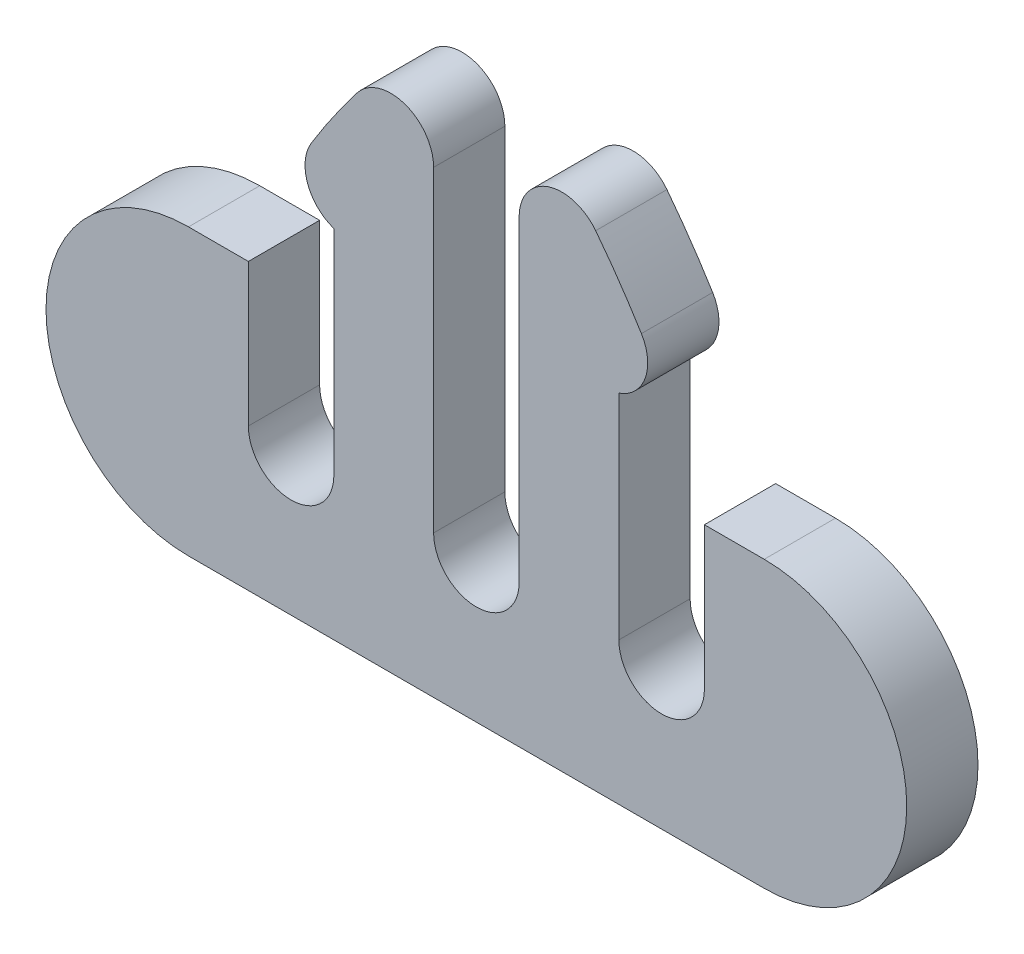
ISO-10303-21;
HEADER;
FILE_DESCRIPTION(('STEP AP214'),'2;1');
FILE_NAME('part.step','',(''),(''),'','','');
FILE_SCHEMA(('AUTOMOTIVE_DESIGN { 1 0 10303 214 1 1 1 1 }'));
ENDSEC;
DATA;
#1=APPLICATION_CONTEXT('core data for automotive mechanical design processes');
#2=APPLICATION_PROTOCOL_DEFINITION('international standard','automotive_design',2000,#1);
#3=PRODUCT_CONTEXT('',#1,'mechanical');
#4=PRODUCT('Part','Part','',(#3));
#5=PRODUCT_RELATED_PRODUCT_CATEGORY('part','',(#4));
#6=PRODUCT_DEFINITION_FORMATION('','',#4);
#7=PRODUCT_DEFINITION_CONTEXT('part definition',#1,'design');
#8=PRODUCT_DEFINITION('design','',#6,#7);
#9=PRODUCT_DEFINITION_SHAPE('','',#8);
#10=(LENGTH_UNIT() NAMED_UNIT(*) SI_UNIT(.MILLI.,.METRE.));
#11=(NAMED_UNIT(*) PLANE_ANGLE_UNIT() SI_UNIT($,.RADIAN.));
#12=(NAMED_UNIT(*) SI_UNIT($,.STERADIAN.) SOLID_ANGLE_UNIT());
#13=UNCERTAINTY_MEASURE_WITH_UNIT(LENGTH_MEASURE(1.E-05),#10,'distance_accuracy_value','');
#14=(GEOMETRIC_REPRESENTATION_CONTEXT(3) GLOBAL_UNCERTAINTY_ASSIGNED_CONTEXT((#13)) GLOBAL_UNIT_ASSIGNED_CONTEXT((#10,
#11,#12)) REPRESENTATION_CONTEXT('',''));
#15=CARTESIAN_POINT('',(0.,0.,0.));
#16=DIRECTION('',(0.,0.,1.));
#17=DIRECTION('',(1.,0.,0.));
#18=AXIS2_PLACEMENT_3D('',#15,#16,#17);
#19=CARTESIAN_POINT('',(-22.8376155637193,46.0831774343637,2.5));
#20=DIRECTION('',(1.,0.,0.));
#21=DIRECTION('',(0.,0.,-1.));
#22=AXIS2_PLACEMENT_3D('',#19,#20,#21);
#23=PLANE('',#22);
#24=DIRECTION('',(0.,-1.,0.));
#25=VECTOR('',#24,1.);
#26=CARTESIAN_POINT('',(-22.8376155637193,46.0831774343637,0.));
#27=LINE('',#26,#25);
#28=CARTESIAN_POINT('',(-22.8376155637193,48.5831774343637,0.));
#29=VERTEX_POINT('',#28);
#30=CARTESIAN_POINT('',(-22.8376155637193,41.0831774343637,0.));
#31=VERTEX_POINT('',#30);
#32=EDGE_CURVE('E388',#29,#31,#27,.T.);
#33=ORIENTED_EDGE('',*,*,#32,.T.);
#34=DIRECTION('',(0.,0.,1.));
#35=VECTOR('',#34,1.);
#36=CARTESIAN_POINT('',(-22.8376155637193,41.0831774343637,-8.54400374531753));
#37=LINE('',#36,#35);
#38=CARTESIAN_POINT('',(-22.8376155637193,41.0831774343637,2.5));
#39=VERTEX_POINT('',#38);
#40=EDGE_CURVE('E208',#31,#39,#37,.T.);
#41=ORIENTED_EDGE('',*,*,#40,.T.);
#42=DIRECTION('',(0.,-1.,0.));
#43=VECTOR('',#42,1.);
#44=CARTESIAN_POINT('',(-22.8376155637193,46.0831774343637,2.5));
#45=LINE('',#44,#43);
#46=CARTESIAN_POINT('',(-22.8376155637193,48.5831774343637,2.5));
#47=VERTEX_POINT('',#46);
#48=EDGE_CURVE('E237',#47,#39,#45,.T.);
#49=ORIENTED_EDGE('',*,*,#48,.F.);
#50=DIRECTION('',(0.,0.,-1.));
#51=VECTOR('',#50,1.);
#52=CARTESIAN_POINT('',(-22.8376155637193,48.5831774343637,2.5));
#53=LINE('',#52,#51);
#54=EDGE_CURVE('E357',#47,#29,#53,.T.);
#55=ORIENTED_EDGE('',*,*,#54,.T.);
#56=EDGE_LOOP('',(#33,#41,#49,#55));
#57=FACE_BOUND('',#56,.T.);
#58=ADVANCED_FACE('F37',(#57),#23,.F.);
#59=CARTESIAN_POINT('',(-22.8376155637193,46.0831774343637,2.5));
#60=DIRECTION('',(0.,-1.,0.));
#61=DIRECTION('',(0.,0.,-1.));
#62=AXIS2_PLACEMENT_3D('',#59,#60,#61);
#63=PLANE('',#62);
#64=DIRECTION('',(-1.,0.,0.));
#65=VECTOR('',#64,1.);
#66=CARTESIAN_POINT('',(-22.8376155637193,46.0831774343637,2.5));
#67=LINE('',#66,#65);
#68=CARTESIAN_POINT('',(-25.8376155637193,46.0831774343637,2.5));
#69=VERTEX_POINT('',#68);
#70=CARTESIAN_POINT('',(-27.9376155637193,46.0831774343637,2.5));
#71=VERTEX_POINT('',#70);
#72=EDGE_CURVE('E239',#69,#71,#67,.T.);
#73=ORIENTED_EDGE('',*,*,#72,.F.);
#74=DIRECTION('',(0.,0.,1.));
#75=VECTOR('',#74,1.);
#76=CARTESIAN_POINT('',(-25.8376155637193,46.0831774343637,-8.54400374531753));
#77=LINE('',#76,#75);
#78=CARTESIAN_POINT('',(-25.8376155637193,46.0831774343637,0.));
#79=VERTEX_POINT('',#78);
#80=EDGE_CURVE('E206',#79,#69,#77,.T.);
#81=ORIENTED_EDGE('',*,*,#80,.F.);
#82=DIRECTION('',(-1.,0.,0.));
#83=VECTOR('',#82,1.);
#84=CARTESIAN_POINT('',(-22.8376155637193,46.0831774343637,0.));
#85=LINE('',#84,#83);
#86=CARTESIAN_POINT('',(-27.9376155637193,46.0831774343637,0.));
#87=VERTEX_POINT('',#86);
#88=EDGE_CURVE('E386',#79,#87,#85,.T.);
#89=ORIENTED_EDGE('',*,*,#88,.T.);
#90=DIRECTION('',(0.,0.,-1.));
#91=VECTOR('',#90,1.);
#92=CARTESIAN_POINT('',(-27.9376155637193,46.0831774343637,2.5));
#93=LINE('',#92,#91);
#94=EDGE_CURVE('E343',#71,#87,#93,.T.);
#95=ORIENTED_EDGE('',*,*,#94,.F.);
#96=EDGE_LOOP('',(#73,#81,#89,#95));
#97=FACE_BOUND('',#96,.T.);
#98=ADVANCED_FACE('F288',(#97),#63,.F.);
#99=CARTESIAN_POINT('',(-27.9376155637193,41.0831774343637,2.5));
#100=DIRECTION('',(0.,0.,-1.));
#101=DIRECTION('',(-1.,0.,0.));
#102=AXIS2_PLACEMENT_3D('',#99,#100,#101);
#103=CYLINDRICAL_SURFACE('',#102,5.);
#104=CARTESIAN_POINT('',(-27.9376155637193,41.0831774343637,0.));
#105=DIRECTION('',(0.,0.,1.));
#106=DIRECTION('',(1.,0.,0.));
#107=AXIS2_PLACEMENT_3D('',#104,#105,#106);
#108=CIRCLE('',#107,5.);
#109=CARTESIAN_POINT('',(-27.9376155637193,36.0831774343637,0.));
#110=VERTEX_POINT('',#109);
#111=EDGE_CURVE('E384',#87,#110,#108,.T.);
#112=ORIENTED_EDGE('',*,*,#111,.T.);
#113=DIRECTION('',(0.,0.,-1.));
#114=VECTOR('',#113,1.);
#115=CARTESIAN_POINT('',(-27.9376155637193,36.0831774343637,2.5));
#116=LINE('',#115,#114);
#117=CARTESIAN_POINT('',(-27.9376155637193,36.0831774343637,2.5));
#118=VERTEX_POINT('',#117);
#119=EDGE_CURVE('E346',#118,#110,#116,.T.);
#120=ORIENTED_EDGE('',*,*,#119,.F.);
#121=CARTESIAN_POINT('',(-27.9376155637193,41.0831774343637,2.5));
#122=DIRECTION('',(0.,0.,1.));
#123=DIRECTION('',(1.,0.,0.));
#124=AXIS2_PLACEMENT_3D('',#121,#122,#123);
#125=CIRCLE('',#124,5.);
#126=EDGE_CURVE('E242',#71,#118,#125,.T.);
#127=ORIENTED_EDGE('',*,*,#126,.F.);
#128=ORIENTED_EDGE('',*,*,#94,.T.);
#129=EDGE_LOOP('',(#112,#120,#127,#128));
#130=FACE_BOUND('',#129,.T.);
#131=ADVANCED_FACE('F284',(#130),#103,.T.);
#132=CARTESIAN_POINT('',(-7.73761556371935,36.0831774343637,2.5));
#133=DIRECTION('',(0.,1.,0.));
#134=DIRECTION('',(0.,0.,1.));
#135=AXIS2_PLACEMENT_3D('',#132,#133,#134);
#136=PLANE('',#135);
#137=DIRECTION('',(1.,0.,0.));
#138=VECTOR('',#137,1.);
#139=CARTESIAN_POINT('',(-7.73761556371935,36.0831774343637,0.));
#140=LINE('',#139,#138);
#141=CARTESIAN_POINT('',(-7.73761556371935,36.0831774343637,0.));
#142=VERTEX_POINT('',#141);
#143=EDGE_CURVE('E382',#110,#142,#140,.T.);
#144=ORIENTED_EDGE('',*,*,#143,.T.);
#145=DIRECTION('',(0.,0.,-1.));
#146=VECTOR('',#145,1.);
#147=CARTESIAN_POINT('',(-7.73761556371935,36.0831774343637,2.5));
#148=LINE('',#147,#146);
#149=CARTESIAN_POINT('',(-7.73761556371935,36.0831774343637,2.5));
#150=VERTEX_POINT('',#149);
#151=EDGE_CURVE('E349',#150,#142,#148,.T.);
#152=ORIENTED_EDGE('',*,*,#151,.F.);
#153=DIRECTION('',(1.,0.,0.));
#154=VECTOR('',#153,1.);
#155=CARTESIAN_POINT('',(-7.73761556371935,36.0831774343637,2.5));
#156=LINE('',#155,#154);
#157=EDGE_CURVE('E244',#118,#150,#156,.T.);
#158=ORIENTED_EDGE('',*,*,#157,.F.);
#159=ORIENTED_EDGE('',*,*,#119,.T.);
#160=EDGE_LOOP('',(#144,#152,#158,#159));
#161=FACE_BOUND('',#160,.T.);
#162=ADVANCED_FACE('F280',(#161),#136,.F.);
#163=CARTESIAN_POINT('',(-7.73761556371935,41.0831774343637,2.5));
#164=DIRECTION('',(0.,0.,-1.));
#165=DIRECTION('',(-1.,0.,0.));
#166=AXIS2_PLACEMENT_3D('',#163,#164,#165);
#167=CYLINDRICAL_SURFACE('',#166,5.);
#168=CARTESIAN_POINT('',(-7.73761556371935,41.0831774343637,0.));
#169=DIRECTION('',(0.,0.,1.));
#170=DIRECTION('',(1.,0.,0.));
#171=AXIS2_PLACEMENT_3D('',#168,#169,#170);
#172=CIRCLE('',#171,5.);
#173=CARTESIAN_POINT('',(-7.73761556371934,46.0831774343637,0.));
#174=VERTEX_POINT('',#173);
#175=EDGE_CURVE('E380',#142,#174,#172,.T.);
#176=ORIENTED_EDGE('',*,*,#175,.T.);
#177=DIRECTION('',(0.,0.,-1.));
#178=VECTOR('',#177,1.);
#179=CARTESIAN_POINT('',(-7.73761556371934,46.0831774343637,2.5));
#180=LINE('',#179,#178);
#181=CARTESIAN_POINT('',(-7.73761556371934,46.0831774343637,2.5));
#182=VERTEX_POINT('',#181);
#183=EDGE_CURVE('E352',#182,#174,#180,.T.);
#184=ORIENTED_EDGE('',*,*,#183,.F.);
#185=CARTESIAN_POINT('',(-7.73761556371935,41.0831774343637,2.5));
#186=DIRECTION('',(0.,0.,1.));
#187=DIRECTION('',(1.,0.,0.));
#188=AXIS2_PLACEMENT_3D('',#185,#186,#187);
#189=CIRCLE('',#188,5.);
#190=EDGE_CURVE('E246',#150,#182,#189,.T.);
#191=ORIENTED_EDGE('',*,*,#190,.F.);
#192=ORIENTED_EDGE('',*,*,#151,.T.);
#193=EDGE_LOOP('',(#176,#184,#191,#192));
#194=FACE_BOUND('',#193,.T.);
#195=ADVANCED_FACE('F276',(#194),#167,.T.);
#196=CARTESIAN_POINT('',(-12.8376155637193,46.0831774343637,2.5));
#197=DIRECTION('',(0.,-1.,0.));
#198=DIRECTION('',(1.,0.,0.));
#199=AXIS2_PLACEMENT_3D('',#196,#197,#198);
#200=PLANE('',#199);
#201=DIRECTION('',(-1.,0.,0.));
#202=VECTOR('',#201,1.);
#203=CARTESIAN_POINT('',(-12.8376155637193,46.0831774343637,0.));
#204=LINE('',#203,#202);
#205=CARTESIAN_POINT('',(-9.83761556371932,46.0831774343637,0.));
#206=VERTEX_POINT('',#205);
#207=EDGE_CURVE('E186',#174,#206,#204,.T.);
#208=ORIENTED_EDGE('',*,*,#207,.T.);
#209=DIRECTION('',(0.,0.,1.));
#210=VECTOR('',#209,1.);
#211=CARTESIAN_POINT('',(-9.83761556371932,46.0831774343637,-8.54400374531753));
#212=LINE('',#211,#210);
#213=CARTESIAN_POINT('',(-9.83761556371932,46.0831774343637,2.5));
#214=VERTEX_POINT('',#213);
#215=EDGE_CURVE('E390',#206,#214,#212,.T.);
#216=ORIENTED_EDGE('',*,*,#215,.T.);
#217=DIRECTION('',(-1.,0.,0.));
#218=VECTOR('',#217,1.);
#219=CARTESIAN_POINT('',(-12.8376155637193,46.0831774343637,2.5));
#220=LINE('',#219,#218);
#221=EDGE_CURVE('E248',#182,#214,#220,.T.);
#222=ORIENTED_EDGE('',*,*,#221,.F.);
#223=ORIENTED_EDGE('',*,*,#183,.T.);
#224=EDGE_LOOP('',(#208,#216,#222,#223));
#225=FACE_BOUND('',#224,.T.);
#226=ADVANCED_FACE('F273',(#225),#200,.F.);
#227=CARTESIAN_POINT('',(-12.8376155637193,46.0831774343637,2.5));
#228=DIRECTION('',(-1.,0.,0.));
#229=DIRECTION('',(0.,-1.,0.));
#230=AXIS2_PLACEMENT_3D('',#227,#228,#229);
#231=PLANE('',#230);
#232=DIRECTION('',(0.,1.,0.));
#233=VECTOR('',#232,1.);
#234=CARTESIAN_POINT('',(-12.8376155637193,46.0831774343637,0.));
#235=LINE('',#234,#233);
#236=CARTESIAN_POINT('',(-12.8376155637193,41.0831774343637,0.));
#237=VERTEX_POINT('',#236);
#238=CARTESIAN_POINT('',(-12.8376155637193,48.5831774343637,0.));
#239=VERTEX_POINT('',#238);
#240=EDGE_CURVE('E173',#237,#239,#235,.T.);
#241=ORIENTED_EDGE('',*,*,#240,.T.);
#242=DIRECTION('',(0.,0.,-1.));
#243=VECTOR('',#242,1.);
#244=CARTESIAN_POINT('',(-12.8376155637193,48.5831774343637,2.5));
#245=LINE('',#244,#243);
#246=CARTESIAN_POINT('',(-12.8376155637193,48.5831774343637,2.5));
#247=VERTEX_POINT('',#246);
#248=EDGE_CURVE('E355',#247,#239,#245,.T.);
#249=ORIENTED_EDGE('',*,*,#248,.F.);
#250=DIRECTION('',(0.,1.,0.));
#251=VECTOR('',#250,1.);
#252=CARTESIAN_POINT('',(-12.8376155637193,46.0831774343637,2.5));
#253=LINE('',#252,#251);
#254=CARTESIAN_POINT('',(-12.8376155637193,41.0831774343637,2.5));
#255=VERTEX_POINT('',#254);
#256=EDGE_CURVE('E198',#255,#247,#253,.T.);
#257=ORIENTED_EDGE('',*,*,#256,.F.);
#258=DIRECTION('',(0.,0.,1.));
#259=VECTOR('',#258,1.);
#260=CARTESIAN_POINT('',(-12.8376155637193,41.0831774343637,-8.54400374531753));
#261=LINE('',#260,#259);
#262=EDGE_CURVE('E193',#237,#255,#261,.T.);
#263=ORIENTED_EDGE('',*,*,#262,.F.);
#264=EDGE_LOOP('',(#241,#249,#257,#263));
#265=FACE_BOUND('',#264,.T.);
#266=ADVANCED_FACE('F197',(#265),#231,.F.);
#267=CARTESIAN_POINT('',(-10.8376155637193,48.5831774343637,2.5));
#268=CARTESIAN_POINT('',(-12.9156114005062,52.8259804873867,2.5));
#269=CARTESIAN_POINT('',(-16.3376155637194,56.0831774343637,2.5));
#270=B_SPLINE_CURVE_WITH_KNOTS('',2,(#267,#268,#269),.UNSPECIFIED.,.F.,.F.,(3,3),(0.,1.),.UNSPECIFIED.);
#271=DIRECTION('',(0.,0.,-1.));
#272=VECTOR('',#271,1.);
#273=SURFACE_OF_LINEAR_EXTRUSION('',#270,#272);
#274=CARTESIAN_POINT('',(-10.8376155637193,48.5831774343637,0.));
#275=CARTESIAN_POINT('',(-12.9156114005062,52.8259804873867,0.));
#276=CARTESIAN_POINT('',(-16.3376155637194,56.0831774343637,0.));
#277=B_SPLINE_CURVE_WITH_KNOTS('',2,(#274,#275,#276),.UNSPECIFIED.,.F.,.F.,(3,3),(0.,1.),.UNSPECIFIED.);
#278=CARTESIAN_POINT('',(-12.047076287336,50.7850983369889,0.));
#279=VERTEX_POINT('',#278);
#280=CARTESIAN_POINT('',(-13.6510916761445,53.109959341012,0.));
#281=VERTEX_POINT('',#280);
#282=EDGE_CURVE('E185',#279,#281,#277,.T.);
#283=ORIENTED_EDGE('',*,*,#282,.T.);
#284=DIRECTION('',(0.,0.,-1.));
#285=VECTOR('',#284,1.);
#286=CARTESIAN_POINT('',(-13.6510916761445,53.109959341012,0.));
#287=LINE('',#286,#285);
#288=CARTESIAN_POINT('',(-13.6510916761445,53.109959341012,2.5));
#289=VERTEX_POINT('',#288);
#290=EDGE_CURVE('E315',#281,#289,#287,.F.);
#291=ORIENTED_EDGE('',*,*,#290,.T.);
#292=CARTESIAN_POINT('',(-12.047076287336,50.7850983369889,2.5));
#293=VERTEX_POINT('',#292);
#294=EDGE_CURVE('E252',#293,#289,#270,.T.);
#295=ORIENTED_EDGE('',*,*,#294,.F.);
#296=DIRECTION('',(0.,0.,-1.));
#297=VECTOR('',#296,1.);
#298=CARTESIAN_POINT('',(-12.047076287336,50.7850983369889,2.5));
#299=LINE('',#298,#297);
#300=EDGE_CURVE('E340',#293,#279,#299,.T.);
#301=ORIENTED_EDGE('',*,*,#300,.T.);
#302=EDGE_LOOP('',(#283,#291,#295,#301));
#303=FACE_BOUND('',#302,.T.);
#304=ADVANCED_FACE('F264',(#303),#273,.F.);
#305=CARTESIAN_POINT('',(-16.3376155637193,56.0831774343637,2.5));
#306=DIRECTION('',(1.,0.,0.));
#307=DIRECTION('',(0.,0.,-1.));
#308=AXIS2_PLACEMENT_3D('',#305,#306,#307);
#309=PLANE('',#308);
#310=DIRECTION('',(0.,-1.,0.));
#311=VECTOR('',#310,1.);
#312=CARTESIAN_POINT('',(-16.3376155637193,56.0831774343637,2.5));
#313=LINE('',#312,#311);
#314=CARTESIAN_POINT('',(-16.3376155637193,52.1922660021377,2.5));
#315=VERTEX_POINT('',#314);
#316=CARTESIAN_POINT('',(-16.3376155637193,41.0831774343637,2.5));
#317=VERTEX_POINT('',#316);
#318=EDGE_CURVE('E258',#315,#317,#313,.T.);
#319=ORIENTED_EDGE('',*,*,#318,.F.);
#320=DIRECTION('',(0.,0.,-1.));
#321=VECTOR('',#320,1.);
#322=CARTESIAN_POINT('',(-16.3376155637193,52.1922660021377,2.5));
#323=LINE('',#322,#321);
#324=CARTESIAN_POINT('',(-16.3376155637193,52.1922660021377,0.));
#325=VERTEX_POINT('',#324);
#326=EDGE_CURVE('E317',#315,#325,#323,.T.);
#327=ORIENTED_EDGE('',*,*,#326,.T.);
#328=DIRECTION('',(0.,-1.,0.));
#329=VECTOR('',#328,1.);
#330=CARTESIAN_POINT('',(-16.3376155637193,56.0831774343637,0.));
#331=LINE('',#330,#329);
#332=CARTESIAN_POINT('',(-16.3376155637193,41.0831774343637,0.));
#333=VERTEX_POINT('',#332);
#334=EDGE_CURVE('E369',#325,#333,#331,.T.);
#335=ORIENTED_EDGE('',*,*,#334,.T.);
#336=DIRECTION('',(0.,0.,1.));
#337=VECTOR('',#336,1.);
#338=CARTESIAN_POINT('',(-16.3376155637193,41.0831774343637,-8.54400374531753));
#339=LINE('',#338,#337);
#340=EDGE_CURVE('E230',#333,#317,#339,.T.);
#341=ORIENTED_EDGE('',*,*,#340,.T.);
#342=EDGE_LOOP('',(#319,#327,#335,#341));
#343=FACE_BOUND('',#342,.T.);
#344=ADVANCED_FACE('F268',(#343),#309,.F.);
#345=CARTESIAN_POINT('',(-19.3376155637193,56.0831774343637,2.5));
#346=DIRECTION('',(-1.,0.,0.));
#347=DIRECTION('',(0.,0.,1.));
#348=AXIS2_PLACEMENT_3D('',#345,#346,#347);
#349=PLANE('',#348);
#350=DIRECTION('',(0.,1.,0.));
#351=VECTOR('',#350,1.);
#352=CARTESIAN_POINT('',(-19.3376155637193,56.0831774343637,0.));
#353=LINE('',#352,#351);
#354=CARTESIAN_POINT('',(-19.3376155637193,41.0831774343637,0.));
#355=VERTEX_POINT('',#354);
#356=CARTESIAN_POINT('',(-19.3376155637193,52.1922660021376,0.));
#357=VERTEX_POINT('',#356);
#358=EDGE_CURVE('E364',#355,#357,#353,.T.);
#359=ORIENTED_EDGE('',*,*,#358,.T.);
#360=DIRECTION('',(0.,0.,-1.));
#361=VECTOR('',#360,1.);
#362=CARTESIAN_POINT('',(-19.3376155637193,52.1922660021376,2.5));
#363=LINE('',#362,#361);
#364=CARTESIAN_POINT('',(-19.3376155637193,52.1922660021376,2.5));
#365=VERTEX_POINT('',#364);
#366=EDGE_CURVE('E11',#357,#365,#363,.F.);
#367=ORIENTED_EDGE('',*,*,#366,.T.);
#368=DIRECTION('',(0.,1.,0.));
#369=VECTOR('',#368,1.);
#370=CARTESIAN_POINT('',(-19.3376155637193,56.0831774343637,2.5));
#371=LINE('',#370,#369);
#372=CARTESIAN_POINT('',(-19.3376155637193,41.0831774343637,2.5));
#373=VERTEX_POINT('',#372);
#374=EDGE_CURVE('E394',#373,#365,#371,.T.);
#375=ORIENTED_EDGE('',*,*,#374,.F.);
#376=DIRECTION('',(0.,0.,1.));
#377=VECTOR('',#376,1.);
#378=CARTESIAN_POINT('',(-19.3376155637193,41.0831774343637,-8.54400374531753));
#379=LINE('',#378,#377);
#380=EDGE_CURVE('E226',#355,#373,#379,.T.);
#381=ORIENTED_EDGE('',*,*,#380,.F.);
#382=EDGE_LOOP('',(#359,#367,#375,#381));
#383=FACE_BOUND('',#382,.T.);
#384=ADVANCED_FACE('F403',(#383),#349,.F.);
#385=CARTESIAN_POINT('',(-19.3376155637192,56.0831774343637,2.5));
#386=CARTESIAN_POINT('',(-22.7596197269324,52.8259804873867,2.5));
#387=CARTESIAN_POINT('',(-24.8376155637193,48.5831774343637,2.5));
#388=B_SPLINE_CURVE_WITH_KNOTS('',2,(#385,#386,#387),.UNSPECIFIED.,.F.,.F.,(3,3),(0.,1.),.UNSPECIFIED.);
#389=DIRECTION('',(0.,0.,-1.));
#390=VECTOR('',#389,1.);
#391=SURFACE_OF_LINEAR_EXTRUSION('',#388,#390);
#392=CARTESIAN_POINT('',(-22.0241394512941,53.109959341012,2.5));
#393=VERTEX_POINT('',#392);
#394=CARTESIAN_POINT('',(-23.6281548401027,50.7850983369889,2.5));
#395=VERTEX_POINT('',#394);
#396=EDGE_CURVE('E360',#393,#395,#388,.T.);
#397=ORIENTED_EDGE('',*,*,#396,.F.);
#398=DIRECTION('',(0.,0.,-1.));
#399=VECTOR('',#398,1.);
#400=CARTESIAN_POINT('',(-22.0241394512941,53.109959341012,2.5));
#401=LINE('',#400,#399);
#402=CARTESIAN_POINT('',(-22.0241394512941,53.109959341012,0.));
#403=VERTEX_POINT('',#402);
#404=EDGE_CURVE('E45',#393,#403,#401,.T.);
#405=ORIENTED_EDGE('',*,*,#404,.T.);
#406=CARTESIAN_POINT('',(-19.3376155637192,56.0831774343637,0.));
#407=CARTESIAN_POINT('',(-22.7596197269324,52.8259804873867,0.));
#408=CARTESIAN_POINT('',(-24.8376155637193,48.5831774343637,0.));
#409=B_SPLINE_CURVE_WITH_KNOTS('',2,(#406,#407,#408),.UNSPECIFIED.,.F.,.F.,(3,3),(0.,1.),.UNSPECIFIED.);
#410=CARTESIAN_POINT('',(-23.6281548401027,50.7850983369889,0.));
#411=VERTEX_POINT('',#410);
#412=EDGE_CURVE('E240',#403,#411,#409,.T.);
#413=ORIENTED_EDGE('',*,*,#412,.T.);
#414=DIRECTION('',(0.,0.,-1.));
#415=VECTOR('',#414,1.);
#416=CARTESIAN_POINT('',(-23.6281548401027,50.7850983369889,0.));
#417=LINE('',#416,#415);
#418=EDGE_CURVE('E329',#411,#395,#417,.F.);
#419=ORIENTED_EDGE('',*,*,#418,.T.);
#420=EDGE_LOOP('',(#397,#405,#413,#419));
#421=FACE_BOUND('',#420,.T.);
#422=ADVANCED_FACE('F399',(#421),#391,.F.);
#423=CARTESIAN_POINT('',(-22.4236176453259,52.5795789608752,2.5));
#424=DIRECTION('',(0.,0.,-1.));
#425=DIRECTION('',(-1.,0.,0.));
#426=AXIS2_PLACEMENT_3D('',#423,#424,#425);
#427=PLANE('',#426);
#428=ORIENTED_EDGE('',*,*,#294,.T.);
#429=CARTESIAN_POINT('',(-14.8376155637193,52.1922660021377,2.5));
#430=DIRECTION('',(0.,0.,-1.));
#431=DIRECTION('',(-1.,0.,0.));
#432=AXIS2_PLACEMENT_3D('',#429,#430,#431);
#433=CIRCLE('',#432,1.5);
#434=EDGE_CURVE('E314',#289,#315,#433,.F.);
#435=ORIENTED_EDGE('',*,*,#434,.T.);
#436=ORIENTED_EDGE('',*,*,#318,.T.);
#437=CARTESIAN_POINT('',(-17.8376155637193,41.0831774343637,2.5));
#438=DIRECTION('',(0.,0.,1.));
#439=DIRECTION('',(-1.,0.,0.));
#440=AXIS2_PLACEMENT_3D('',#437,#438,#439);
#441=CIRCLE('',#440,1.5);
#442=EDGE_CURVE('E209',#373,#317,#441,.T.);
#443=ORIENTED_EDGE('',*,*,#442,.F.);
#444=ORIENTED_EDGE('',*,*,#374,.T.);
#445=CARTESIAN_POINT('',(-20.8376155637193,52.1922660021376,2.5));
#446=DIRECTION('',(0.,0.,-1.));
#447=DIRECTION('',(-1.,0.,0.));
#448=AXIS2_PLACEMENT_3D('',#445,#446,#447);
#449=CIRCLE('',#448,1.5);
#450=EDGE_CURVE('E52',#365,#393,#449,.F.);
#451=ORIENTED_EDGE('',*,*,#450,.T.);
#452=ORIENTED_EDGE('',*,*,#396,.T.);
#453=CARTESIAN_POINT('',(-22.3491535392985,50.0014174883386,2.5));
#454=DIRECTION('',(0.,0.,-1.));
#455=DIRECTION('',(-1.,0.,0.));
#456=AXIS2_PLACEMENT_3D('',#453,#454,#455);
#457=CIRCLE('',#456,1.5);
#458=EDGE_CURVE('E334',#395,#47,#457,.F.);
#459=ORIENTED_EDGE('',*,*,#458,.T.);
#460=ORIENTED_EDGE('',*,*,#48,.T.);
#461=CARTESIAN_POINT('',(-24.3376155637193,41.0831774343637,2.5));
#462=DIRECTION('',(0.,0.,1.));
#463=DIRECTION('',(-1.,0.,0.));
#464=AXIS2_PLACEMENT_3D('',#461,#462,#463);
#465=CIRCLE('',#464,1.5);
#466=CARTESIAN_POINT('',(-25.8376155637193,41.0831774343637,2.5));
#467=VERTEX_POINT('',#466);
#468=EDGE_CURVE('E220',#467,#39,#465,.T.);
#469=ORIENTED_EDGE('',*,*,#468,.F.);
#470=DIRECTION('',(0.,-1.,0.));
#471=VECTOR('',#470,1.);
#472=CARTESIAN_POINT('',(-25.8376155637193,46.0831774343637,2.5));
#473=LINE('',#472,#471);
#474=EDGE_CURVE('E221',#69,#467,#473,.T.);
#475=ORIENTED_EDGE('',*,*,#474,.F.);
#476=ORIENTED_EDGE('',*,*,#72,.T.);
#477=ORIENTED_EDGE('',*,*,#126,.T.);
#478=ORIENTED_EDGE('',*,*,#157,.T.);
#479=ORIENTED_EDGE('',*,*,#190,.T.);
#480=ORIENTED_EDGE('',*,*,#221,.T.);
#481=DIRECTION('',(0.,1.,0.));
#482=VECTOR('',#481,1.);
#483=CARTESIAN_POINT('',(-9.83761556371932,46.0831774343637,2.5));
#484=LINE('',#483,#482);
#485=CARTESIAN_POINT('',(-9.83761556371932,41.0831774343637,2.5));
#486=VERTEX_POINT('',#485);
#487=EDGE_CURVE('E199',#486,#214,#484,.T.);
#488=ORIENTED_EDGE('',*,*,#487,.F.);
#489=CARTESIAN_POINT('',(-11.3376155637193,41.0831774343637,2.5));
#490=DIRECTION('',(0.,0.,1.));
#491=DIRECTION('',(1.,0.,0.));
#492=AXIS2_PLACEMENT_3D('',#489,#490,#491);
#493=CIRCLE('',#492,1.5);
#494=EDGE_CURVE('E201',#255,#486,#493,.T.);
#495=ORIENTED_EDGE('',*,*,#494,.F.);
#496=ORIENTED_EDGE('',*,*,#256,.T.);
#497=CARTESIAN_POINT('',(-13.3260775881401,50.0014174883386,2.5));
#498=DIRECTION('',(0.,0.,-1.));
#499=DIRECTION('',(-1.,0.,0.));
#500=AXIS2_PLACEMENT_3D('',#497,#498,#499);
#501=CIRCLE('',#500,1.5);
#502=EDGE_CURVE('E332',#247,#293,#501,.F.);
#503=ORIENTED_EDGE('',*,*,#502,.T.);
#504=EDGE_LOOP('',(#428,#435,#436,#443,#444,#451,#452,#459,#460,#469,#475,#476,#477,#478,#479,
#480,#488,#495,#496,#503));
#505=FACE_BOUND('',#504,.T.);
#506=ADVANCED_FACE('F402',(#505),#427,.F.);
#507=CARTESIAN_POINT('',(-22.4236176453259,52.5795789608752,0.));
#508=DIRECTION('',(0.,0.,-1.));
#509=DIRECTION('',(-1.,0.,0.));
#510=AXIS2_PLACEMENT_3D('',#507,#508,#509);
#511=PLANE('',#510);
#512=ORIENTED_EDGE('',*,*,#334,.F.);
#513=CARTESIAN_POINT('',(-14.8376155637193,52.1922660021377,0.));
#514=DIRECTION('',(0.,0.,-1.));
#515=DIRECTION('',(-1.,0.,0.));
#516=AXIS2_PLACEMENT_3D('',#513,#514,#515);
#517=CIRCLE('',#516,1.5);
#518=EDGE_CURVE('E324',#325,#281,#517,.T.);
#519=ORIENTED_EDGE('',*,*,#518,.T.);
#520=ORIENTED_EDGE('',*,*,#282,.F.);
#521=CARTESIAN_POINT('',(-13.3260775881401,50.0014174883386,0.));
#522=DIRECTION('',(0.,0.,-1.));
#523=DIRECTION('',(-1.,0.,0.));
#524=AXIS2_PLACEMENT_3D('',#521,#522,#523);
#525=CIRCLE('',#524,1.5);
#526=EDGE_CURVE('E180',#279,#239,#525,.T.);
#527=ORIENTED_EDGE('',*,*,#526,.T.);
#528=ORIENTED_EDGE('',*,*,#240,.F.);
#529=CARTESIAN_POINT('',(-11.3376155637193,41.0831774343637,0.));
#530=DIRECTION('',(0.,0.,-1.));
#531=DIRECTION('',(-1.,0.,0.));
#532=AXIS2_PLACEMENT_3D('',#529,#530,#531);
#533=CIRCLE('',#532,1.5);
#534=CARTESIAN_POINT('',(-9.83761556371932,41.0831774343637,0.));
#535=VERTEX_POINT('',#534);
#536=EDGE_CURVE('E178',#237,#535,#533,.F.);
#537=ORIENTED_EDGE('',*,*,#536,.T.);
#538=DIRECTION('',(0.,1.,0.));
#539=VECTOR('',#538,1.);
#540=CARTESIAN_POINT('',(-9.83761556371932,46.0831774343637,0.));
#541=LINE('',#540,#539);
#542=EDGE_CURVE('E445',#535,#206,#541,.T.);
#543=ORIENTED_EDGE('',*,*,#542,.T.);
#544=ORIENTED_EDGE('',*,*,#207,.F.);
#545=ORIENTED_EDGE('',*,*,#175,.F.);
#546=ORIENTED_EDGE('',*,*,#143,.F.);
#547=ORIENTED_EDGE('',*,*,#111,.F.);
#548=ORIENTED_EDGE('',*,*,#88,.F.);
#549=DIRECTION('',(0.,-1.,0.));
#550=VECTOR('',#549,1.);
#551=CARTESIAN_POINT('',(-25.8376155637193,46.0831774343637,0.));
#552=LINE('',#551,#550);
#553=CARTESIAN_POINT('',(-25.8376155637193,41.0831774343637,0.));
#554=VERTEX_POINT('',#553);
#555=EDGE_CURVE('E212',#79,#554,#552,.T.);
#556=ORIENTED_EDGE('',*,*,#555,.T.);
#557=CARTESIAN_POINT('',(-24.3376155637193,41.0831774343637,0.));
#558=DIRECTION('',(0.,0.,-1.));
#559=DIRECTION('',(-1.,0.,0.));
#560=AXIS2_PLACEMENT_3D('',#557,#558,#559);
#561=CIRCLE('',#560,1.5);
#562=EDGE_CURVE('E213',#554,#31,#561,.F.);
#563=ORIENTED_EDGE('',*,*,#562,.T.);
#564=ORIENTED_EDGE('',*,*,#32,.F.);
#565=CARTESIAN_POINT('',(-22.3491535392985,50.0014174883386,0.));
#566=DIRECTION('',(0.,0.,-1.));
#567=DIRECTION('',(-1.,0.,0.));
#568=AXIS2_PLACEMENT_3D('',#565,#566,#567);
#569=CIRCLE('',#568,1.5);
#570=EDGE_CURVE('E337',#29,#411,#569,.T.);
#571=ORIENTED_EDGE('',*,*,#570,.T.);
#572=ORIENTED_EDGE('',*,*,#412,.F.);
#573=CARTESIAN_POINT('',(-20.8376155637193,52.1922660021376,0.));
#574=DIRECTION('',(0.,0.,-1.));
#575=DIRECTION('',(-1.,0.,0.));
#576=AXIS2_PLACEMENT_3D('',#573,#574,#575);
#577=CIRCLE('',#576,1.5);
#578=EDGE_CURVE('E326',#403,#357,#577,.T.);
#579=ORIENTED_EDGE('',*,*,#578,.T.);
#580=ORIENTED_EDGE('',*,*,#358,.F.);
#581=CARTESIAN_POINT('',(-17.8376155637193,41.0831774343637,0.));
#582=DIRECTION('',(0.,0.,-1.));
#583=DIRECTION('',(-1.,0.,0.));
#584=AXIS2_PLACEMENT_3D('',#581,#582,#583);
#585=CIRCLE('',#584,1.5);
#586=EDGE_CURVE('E229',#355,#333,#585,.F.);
#587=ORIENTED_EDGE('',*,*,#586,.T.);
#588=EDGE_LOOP('',(#512,#519,#520,#527,#528,#537,#543,#544,#545,#546,#547,#548,#556,#563,#564,
#571,#572,#579,#580,#587));
#589=FACE_BOUND('',#588,.T.);
#590=ADVANCED_FACE('F176',(#589),#511,.T.);
#591=CARTESIAN_POINT('',(-17.8376155637193,41.0831774343637,-8.54400374531753));
#592=DIRECTION('',(0.,0.,1.));
#593=DIRECTION('',(1.,0.,0.));
#594=AXIS2_PLACEMENT_3D('',#591,#592,#593);
#595=CYLINDRICAL_SURFACE('',#594,1.5);
#596=ORIENTED_EDGE('',*,*,#380,.T.);
#597=ORIENTED_EDGE('',*,*,#442,.T.);
#598=ORIENTED_EDGE('',*,*,#340,.F.);
#599=ORIENTED_EDGE('',*,*,#586,.F.);
#600=EDGE_LOOP('',(#596,#597,#598,#599));
#601=FACE_BOUND('',#600,.T.);
#602=ADVANCED_FACE('F450',(#601),#595,.F.);
#603=CARTESIAN_POINT('',(-25.8376155637193,46.0831774343637,-8.54400374531753));
#604=DIRECTION('',(-1.,0.,0.));
#605=DIRECTION('',(0.,0.,1.));
#606=AXIS2_PLACEMENT_3D('',#603,#604,#605);
#607=PLANE('',#606);
#608=ORIENTED_EDGE('',*,*,#80,.T.);
#609=ORIENTED_EDGE('',*,*,#474,.T.);
#610=DIRECTION('',(0.,0.,1.));
#611=VECTOR('',#610,1.);
#612=CARTESIAN_POINT('',(-25.8376155637193,41.0831774343637,-8.54400374531753));
#613=LINE('',#612,#611);
#614=EDGE_CURVE('E210',#554,#467,#613,.T.);
#615=ORIENTED_EDGE('',*,*,#614,.F.);
#616=ORIENTED_EDGE('',*,*,#555,.F.);
#617=EDGE_LOOP('',(#608,#609,#615,#616));
#618=FACE_BOUND('',#617,.T.);
#619=ADVANCED_FACE('F448',(#618),#607,.F.);
#620=CARTESIAN_POINT('',(-24.3376155637193,41.0831774343637,-8.54400374531753));
#621=DIRECTION('',(0.,0.,1.));
#622=DIRECTION('',(1.,0.,0.));
#623=AXIS2_PLACEMENT_3D('',#620,#621,#622);
#624=CYLINDRICAL_SURFACE('',#623,1.5);
#625=ORIENTED_EDGE('',*,*,#614,.T.);
#626=ORIENTED_EDGE('',*,*,#468,.T.);
#627=ORIENTED_EDGE('',*,*,#40,.F.);
#628=ORIENTED_EDGE('',*,*,#562,.F.);
#629=EDGE_LOOP('',(#625,#626,#627,#628));
#630=FACE_BOUND('',#629,.T.);
#631=ADVANCED_FACE('F423',(#630),#624,.F.);
#632=CARTESIAN_POINT('',(-11.3376155637193,41.0831774343637,-8.54400374531753));
#633=DIRECTION('',(0.,0.,1.));
#634=DIRECTION('',(1.,0.,0.));
#635=AXIS2_PLACEMENT_3D('',#632,#633,#634);
#636=CYLINDRICAL_SURFACE('',#635,1.5);
#637=ORIENTED_EDGE('',*,*,#262,.T.);
#638=ORIENTED_EDGE('',*,*,#494,.T.);
#639=DIRECTION('',(0.,0.,1.));
#640=VECTOR('',#639,1.);
#641=CARTESIAN_POINT('',(-9.83761556371932,41.0831774343637,-8.54400374531753));
#642=LINE('',#641,#640);
#643=EDGE_CURVE('E195',#535,#486,#642,.T.);
#644=ORIENTED_EDGE('',*,*,#643,.F.);
#645=ORIENTED_EDGE('',*,*,#536,.F.);
#646=EDGE_LOOP('',(#637,#638,#644,#645));
#647=FACE_BOUND('',#646,.T.);
#648=ADVANCED_FACE('F191',(#647),#636,.F.);
#649=CARTESIAN_POINT('',(-9.83761556371932,46.0831774343637,-8.54400374531753));
#650=DIRECTION('',(1.,0.,0.));
#651=DIRECTION('',(0.,0.,-1.));
#652=AXIS2_PLACEMENT_3D('',#649,#650,#651);
#653=PLANE('',#652);
#654=ORIENTED_EDGE('',*,*,#643,.T.);
#655=ORIENTED_EDGE('',*,*,#487,.T.);
#656=ORIENTED_EDGE('',*,*,#215,.F.);
#657=ORIENTED_EDGE('',*,*,#542,.F.);
#658=EDGE_LOOP('',(#654,#655,#656,#657));
#659=FACE_BOUND('',#658,.T.);
#660=ADVANCED_FACE('F300',(#659),#653,.F.);
#661=CARTESIAN_POINT('',(-13.3260775881401,50.0014174883386,1.25));
#662=DIRECTION('',(0.,0.,-1.));
#663=DIRECTION('',(-1.,0.,0.));
#664=AXIS2_PLACEMENT_3D('',#661,#662,#663);
#665=CYLINDRICAL_SURFACE('',#664,1.5);
#666=ORIENTED_EDGE('',*,*,#502,.F.);
#667=ORIENTED_EDGE('',*,*,#248,.T.);
#668=ORIENTED_EDGE('',*,*,#526,.F.);
#669=ORIENTED_EDGE('',*,*,#300,.F.);
#670=EDGE_LOOP('',(#666,#667,#668,#669));
#671=FACE_BOUND('',#670,.T.);
#672=ADVANCED_FACE('F296',(#671),#665,.T.);
#673=CARTESIAN_POINT('',(-22.3491535392985,50.0014174883386,1.25));
#674=DIRECTION('',(0.,0.,-1.));
#675=DIRECTION('',(-1.,0.,0.));
#676=AXIS2_PLACEMENT_3D('',#673,#674,#675);
#677=CYLINDRICAL_SURFACE('',#676,1.5);
#678=ORIENTED_EDGE('',*,*,#458,.F.);
#679=ORIENTED_EDGE('',*,*,#418,.F.);
#680=ORIENTED_EDGE('',*,*,#570,.F.);
#681=ORIENTED_EDGE('',*,*,#54,.F.);
#682=EDGE_LOOP('',(#678,#679,#680,#681));
#683=FACE_BOUND('',#682,.T.);
#684=ADVANCED_FACE('F299',(#683),#677,.T.);
#685=CARTESIAN_POINT('',(-14.8376155637193,52.1922660021377,1.25));
#686=DIRECTION('',(0.,0.,-1.));
#687=DIRECTION('',(-1.,0.,0.));
#688=AXIS2_PLACEMENT_3D('',#685,#686,#687);
#689=CYLINDRICAL_SURFACE('',#688,1.5);
#690=ORIENTED_EDGE('',*,*,#434,.F.);
#691=ORIENTED_EDGE('',*,*,#290,.F.);
#692=ORIENTED_EDGE('',*,*,#518,.F.);
#693=ORIENTED_EDGE('',*,*,#326,.F.);
#694=EDGE_LOOP('',(#690,#691,#692,#693));
#695=FACE_BOUND('',#694,.T.);
#696=ADVANCED_FACE('F303',(#695),#689,.T.);
#697=CARTESIAN_POINT('',(-20.8376155637193,52.1922660021376,1.25));
#698=DIRECTION('',(0.,0.,-1.));
#699=DIRECTION('',(-1.,0.,0.));
#700=AXIS2_PLACEMENT_3D('',#697,#698,#699);
#701=CYLINDRICAL_SURFACE('',#700,1.5);
#702=ORIENTED_EDGE('',*,*,#450,.F.);
#703=ORIENTED_EDGE('',*,*,#366,.F.);
#704=ORIENTED_EDGE('',*,*,#578,.F.);
#705=ORIENTED_EDGE('',*,*,#404,.F.);
#706=EDGE_LOOP('',(#702,#703,#704,#705));
#707=FACE_BOUND('',#706,.T.);
#708=ADVANCED_FACE('F39',(#707),#701,.T.);
#709=CLOSED_SHELL('',(#58,#98,#131,#162,#195,#226,#266,#304,#344,#384,#422,#506,#590,#602,#619,
#631,#648,#660,#672,#684,#696,#708));
#710=MANIFOLD_SOLID_BREP('B2',#709);
#711=ADVANCED_BREP_SHAPE_REPRESENTATION('',(#18,#710),#14);
#712=SHAPE_DEFINITION_REPRESENTATION(#9,#711);
ENDSEC;
END-ISO-10303-21;
